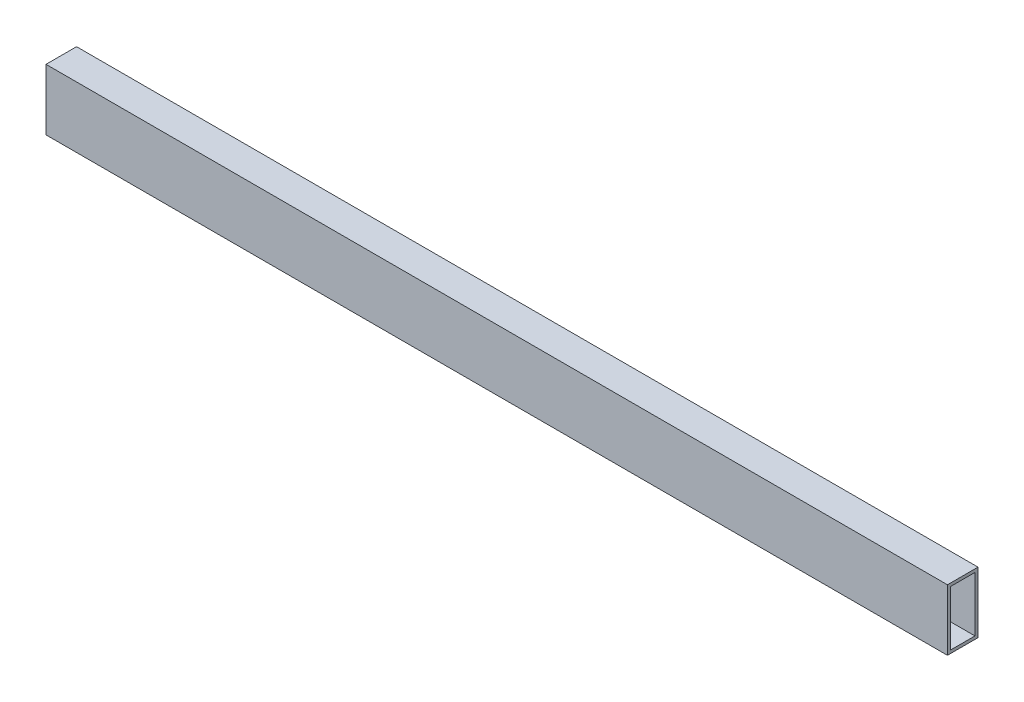
ISO-10303-21;
HEADER;
FILE_DESCRIPTION(('STEP AP214'),'2;1');
FILE_NAME('part.step','',(''),(''),'','','');
FILE_SCHEMA(('AUTOMOTIVE_DESIGN { 1 0 10303 214 1 1 1 1 }'));
ENDSEC;
DATA;
#1=APPLICATION_CONTEXT('core data for automotive mechanical design processes');
#2=APPLICATION_PROTOCOL_DEFINITION('international standard','automotive_design',2000,#1);
#3=PRODUCT_CONTEXT('',#1,'mechanical');
#4=PRODUCT('Part','Part','',(#3));
#5=PRODUCT_RELATED_PRODUCT_CATEGORY('part','',(#4));
#6=PRODUCT_DEFINITION_FORMATION('','',#4);
#7=PRODUCT_DEFINITION_CONTEXT('part definition',#1,'design');
#8=PRODUCT_DEFINITION('design','',#6,#7);
#9=PRODUCT_DEFINITION_SHAPE('','',#8);
#10=(LENGTH_UNIT() NAMED_UNIT(*) SI_UNIT(.MILLI.,.METRE.));
#11=(NAMED_UNIT(*) PLANE_ANGLE_UNIT() SI_UNIT($,.RADIAN.));
#12=(NAMED_UNIT(*) SI_UNIT($,.STERADIAN.) SOLID_ANGLE_UNIT());
#13=UNCERTAINTY_MEASURE_WITH_UNIT(LENGTH_MEASURE(1.E-05),#10,'distance_accuracy_value','');
#14=(GEOMETRIC_REPRESENTATION_CONTEXT(3) GLOBAL_UNCERTAINTY_ASSIGNED_CONTEXT((#13)) GLOBAL_UNIT_ASSIGNED_CONTEXT((#10,
#11,#12)) REPRESENTATION_CONTEXT('',''));
#15=CARTESIAN_POINT('',(0.,0.,0.));
#16=DIRECTION('',(0.,0.,1.));
#17=DIRECTION('',(1.,0.,0.));
#18=AXIS2_PLACEMENT_3D('',#15,#16,#17);
#19=CARTESIAN_POINT('',(0.,-20.,-10.));
#20=DIRECTION('',(0.,0.,-1.));
#21=DIRECTION('',(-1.,0.,0.));
#22=AXIS2_PLACEMENT_3D('',#19,#20,#21);
#23=PLANE('',#22);
#24=DIRECTION('',(1.,0.,0.));
#25=VECTOR('',#24,1.);
#26=CARTESIAN_POINT('',(0.,20.,-10.));
#27=LINE('',#26,#25);
#28=CARTESIAN_POINT('',(0.,20.,-10.));
#29=VERTEX_POINT('',#28);
#30=CARTESIAN_POINT('',(590.,20.,-10.));
#31=VERTEX_POINT('',#30);
#32=EDGE_CURVE('E110',#29,#31,#27,.T.);
#33=ORIENTED_EDGE('',*,*,#32,.T.);
#34=DIRECTION('',(0.,1.,0.));
#35=VECTOR('',#34,1.);
#36=CARTESIAN_POINT('',(590.,-20.,-10.));
#37=LINE('',#36,#35);
#38=CARTESIAN_POINT('',(590.,-20.,-10.));
#39=VERTEX_POINT('',#38);
#40=EDGE_CURVE('E102',#39,#31,#37,.T.);
#41=ORIENTED_EDGE('',*,*,#40,.F.);
#42=DIRECTION('',(1.,0.,0.));
#43=VECTOR('',#42,1.);
#44=CARTESIAN_POINT('',(0.,-20.,-10.));
#45=LINE('',#44,#43);
#46=CARTESIAN_POINT('',(0.,-20.,-10.));
#47=VERTEX_POINT('',#46);
#48=EDGE_CURVE('E97',#47,#39,#45,.T.);
#49=ORIENTED_EDGE('',*,*,#48,.F.);
#50=DIRECTION('',(0.,1.,0.));
#51=VECTOR('',#50,1.);
#52=CARTESIAN_POINT('',(0.,-20.,-10.));
#53=LINE('',#52,#51);
#54=EDGE_CURVE('E106',#47,#29,#53,.T.);
#55=ORIENTED_EDGE('',*,*,#54,.T.);
#56=EDGE_LOOP('',(#33,#41,#49,#55));
#57=FACE_BOUND('',#56,.T.);
#58=ADVANCED_FACE('F39',(#57),#23,.T.);
#59=CARTESIAN_POINT('',(0.,20.,10.));
#60=DIRECTION('',(0.,1.,0.));
#61=DIRECTION('',(0.,0.,1.));
#62=AXIS2_PLACEMENT_3D('',#59,#60,#61);
#63=PLANE('',#62);
#64=DIRECTION('',(1.,0.,0.));
#65=VECTOR('',#64,1.);
#66=CARTESIAN_POINT('',(0.,20.,10.));
#67=LINE('',#66,#65);
#68=CARTESIAN_POINT('',(0.,20.,10.));
#69=VERTEX_POINT('',#68);
#70=CARTESIAN_POINT('',(590.,20.,10.));
#71=VERTEX_POINT('',#70);
#72=EDGE_CURVE('E121',#69,#71,#67,.T.);
#73=ORIENTED_EDGE('',*,*,#72,.T.);
#74=DIRECTION('',(0.,0.,1.));
#75=VECTOR('',#74,1.);
#76=CARTESIAN_POINT('',(590.,20.,10.));
#77=LINE('',#76,#75);
#78=EDGE_CURVE('E132',#31,#71,#77,.T.);
#79=ORIENTED_EDGE('',*,*,#78,.F.);
#80=ORIENTED_EDGE('',*,*,#32,.F.);
#81=DIRECTION('',(0.,0.,1.));
#82=VECTOR('',#81,1.);
#83=CARTESIAN_POINT('',(0.,20.,10.));
#84=LINE('',#83,#82);
#85=EDGE_CURVE('E115',#29,#69,#84,.T.);
#86=ORIENTED_EDGE('',*,*,#85,.T.);
#87=EDGE_LOOP('',(#73,#79,#80,#86));
#88=FACE_BOUND('',#87,.T.);
#89=ADVANCED_FACE('F131',(#88),#63,.T.);
#90=CARTESIAN_POINT('',(0.,-20.,10.));
#91=DIRECTION('',(0.,0.,1.));
#92=DIRECTION('',(1.,0.,0.));
#93=AXIS2_PLACEMENT_3D('',#90,#91,#92);
#94=PLANE('',#93);
#95=DIRECTION('',(1.,0.,0.));
#96=VECTOR('',#95,1.);
#97=CARTESIAN_POINT('',(0.,-20.,10.));
#98=LINE('',#97,#96);
#99=CARTESIAN_POINT('',(0.,-20.,10.));
#100=VERTEX_POINT('',#99);
#101=CARTESIAN_POINT('',(590.,-20.,10.));
#102=VERTEX_POINT('',#101);
#103=EDGE_CURVE('E43',#100,#102,#98,.T.);
#104=ORIENTED_EDGE('',*,*,#103,.T.);
#105=DIRECTION('',(0.,-1.,0.));
#106=VECTOR('',#105,1.);
#107=CARTESIAN_POINT('',(590.,-20.,10.));
#108=LINE('',#107,#106);
#109=EDGE_CURVE('E136',#71,#102,#108,.T.);
#110=ORIENTED_EDGE('',*,*,#109,.F.);
#111=ORIENTED_EDGE('',*,*,#72,.F.);
#112=DIRECTION('',(0.,-1.,0.));
#113=VECTOR('',#112,1.);
#114=CARTESIAN_POINT('',(0.,-20.,10.));
#115=LINE('',#114,#113);
#116=EDGE_CURVE('E89',#69,#100,#115,.T.);
#117=ORIENTED_EDGE('',*,*,#116,.T.);
#118=EDGE_LOOP('',(#104,#110,#111,#117));
#119=FACE_BOUND('',#118,.T.);
#120=ADVANCED_FACE('F218',(#119),#94,.T.);
#121=CARTESIAN_POINT('',(0.,-20.,10.));
#122=DIRECTION('',(0.,-1.,0.));
#123=DIRECTION('',(0.,0.,-1.));
#124=AXIS2_PLACEMENT_3D('',#121,#122,#123);
#125=PLANE('',#124);
#126=DIRECTION('',(0.,0.,-1.));
#127=VECTOR('',#126,1.);
#128=CARTESIAN_POINT('',(590.,-20.,10.));
#129=LINE('',#128,#127);
#130=EDGE_CURVE('E141',#102,#39,#129,.T.);
#131=ORIENTED_EDGE('',*,*,#130,.F.);
#132=ORIENTED_EDGE('',*,*,#103,.F.);
#133=DIRECTION('',(0.,0.,-1.));
#134=VECTOR('',#133,1.);
#135=CARTESIAN_POINT('',(0.,-20.,10.));
#136=LINE('',#135,#134);
#137=EDGE_CURVE('E95',#100,#47,#136,.T.);
#138=ORIENTED_EDGE('',*,*,#137,.T.);
#139=ORIENTED_EDGE('',*,*,#48,.T.);
#140=EDGE_LOOP('',(#131,#132,#138,#139));
#141=FACE_BOUND('',#140,.T.);
#142=ADVANCED_FACE('F41',(#141),#125,.T.);
#143=CARTESIAN_POINT('',(0.,0.,0.));
#144=DIRECTION('',(-1.,0.,0.));
#145=DIRECTION('',(0.,0.,1.));
#146=AXIS2_PLACEMENT_3D('',#143,#144,#145);
#147=PLANE('',#146);
#148=ORIENTED_EDGE('',*,*,#54,.F.);
#149=ORIENTED_EDGE('',*,*,#137,.F.);
#150=ORIENTED_EDGE('',*,*,#116,.F.);
#151=ORIENTED_EDGE('',*,*,#85,.F.);
#152=EDGE_LOOP('',(#148,#149,#150,#151));
#153=FACE_BOUND('',#152,.T.);
#154=DIRECTION('',(0.,-1.,0.));
#155=VECTOR('',#154,1.);
#156=CARTESIAN_POINT('',(0.,-18.,8.));
#157=LINE('',#156,#155);
#158=CARTESIAN_POINT('',(0.,-18.,8.));
#159=VERTEX_POINT('',#158);
#160=CARTESIAN_POINT('',(0.,18.,8.));
#161=VERTEX_POINT('',#160);
#162=EDGE_CURVE('E147',#159,#161,#157,.F.);
#163=ORIENTED_EDGE('',*,*,#162,.F.);
#164=DIRECTION('',(0.,0.,-1.));
#165=VECTOR('',#164,1.);
#166=CARTESIAN_POINT('',(0.,-18.,8.));
#167=LINE('',#166,#165);
#168=CARTESIAN_POINT('',(0.,-18.,-8.));
#169=VERTEX_POINT('',#168);
#170=EDGE_CURVE('E152',#169,#159,#167,.F.);
#171=ORIENTED_EDGE('',*,*,#170,.F.);
#172=DIRECTION('',(0.,1.,0.));
#173=VECTOR('',#172,1.);
#174=CARTESIAN_POINT('',(0.,-18.,-8.));
#175=LINE('',#174,#173);
#176=CARTESIAN_POINT('',(0.,18.,-8.));
#177=VERTEX_POINT('',#176);
#178=EDGE_CURVE('E162',#177,#169,#175,.F.);
#179=ORIENTED_EDGE('',*,*,#178,.F.);
#180=DIRECTION('',(0.,0.,1.));
#181=VECTOR('',#180,1.);
#182=CARTESIAN_POINT('',(0.,18.,8.));
#183=LINE('',#182,#181);
#184=EDGE_CURVE('E145',#161,#177,#183,.F.);
#185=ORIENTED_EDGE('',*,*,#184,.F.);
#186=EDGE_LOOP('',(#163,#171,#179,#185));
#187=FACE_BOUND('',#186,.T.);
#188=ADVANCED_FACE('F113',(#153,#187),#147,.T.);
#189=CARTESIAN_POINT('',(590.,0.,0.));
#190=DIRECTION('',(-1.,0.,0.));
#191=DIRECTION('',(0.,0.,1.));
#192=AXIS2_PLACEMENT_3D('',#189,#190,#191);
#193=PLANE('',#192);
#194=ORIENTED_EDGE('',*,*,#40,.T.);
#195=ORIENTED_EDGE('',*,*,#78,.T.);
#196=ORIENTED_EDGE('',*,*,#109,.T.);
#197=ORIENTED_EDGE('',*,*,#130,.T.);
#198=EDGE_LOOP('',(#194,#195,#196,#197));
#199=FACE_BOUND('',#198,.T.);
#200=DIRECTION('',(0.,-1.,0.));
#201=VECTOR('',#200,1.);
#202=CARTESIAN_POINT('',(590.,-18.,8.));
#203=LINE('',#202,#201);
#204=CARTESIAN_POINT('',(590.,-18.,8.));
#205=VERTEX_POINT('',#204);
#206=CARTESIAN_POINT('',(590.,18.,8.));
#207=VERTEX_POINT('',#206);
#208=EDGE_CURVE('E11',#205,#207,#203,.F.);
#209=ORIENTED_EDGE('',*,*,#208,.T.);
#210=DIRECTION('',(0.,0.,1.));
#211=VECTOR('',#210,1.);
#212=CARTESIAN_POINT('',(590.,18.,8.));
#213=LINE('',#212,#211);
#214=CARTESIAN_POINT('',(590.,18.,-8.));
#215=VERTEX_POINT('',#214);
#216=EDGE_CURVE('E176',#207,#215,#213,.F.);
#217=ORIENTED_EDGE('',*,*,#216,.T.);
#218=DIRECTION('',(0.,1.,0.));
#219=VECTOR('',#218,1.);
#220=CARTESIAN_POINT('',(590.,-18.,-8.));
#221=LINE('',#220,#219);
#222=CARTESIAN_POINT('',(590.,-18.,-8.));
#223=VERTEX_POINT('',#222);
#224=EDGE_CURVE('E166',#215,#223,#221,.F.);
#225=ORIENTED_EDGE('',*,*,#224,.T.);
#226=DIRECTION('',(0.,0.,-1.));
#227=VECTOR('',#226,1.);
#228=CARTESIAN_POINT('',(590.,-18.,8.));
#229=LINE('',#228,#227);
#230=EDGE_CURVE('E58',#223,#205,#229,.F.);
#231=ORIENTED_EDGE('',*,*,#230,.T.);
#232=EDGE_LOOP('',(#209,#217,#225,#231));
#233=FACE_BOUND('',#232,.T.);
#234=ADVANCED_FACE('F135',(#199,#233),#193,.F.);
#235=CARTESIAN_POINT('',(0.,18.,8.));
#236=DIRECTION('',(0.,-1.,0.));
#237=DIRECTION('',(0.,0.,-1.));
#238=AXIS2_PLACEMENT_3D('',#235,#236,#237);
#239=PLANE('',#238);
#240=DIRECTION('',(1.,0.,0.));
#241=VECTOR('',#240,1.);
#242=CARTESIAN_POINT('',(0.,18.,-8.));
#243=LINE('',#242,#241);
#244=EDGE_CURVE('E169',#177,#215,#243,.T.);
#245=ORIENTED_EDGE('',*,*,#244,.T.);
#246=ORIENTED_EDGE('',*,*,#216,.F.);
#247=DIRECTION('',(1.,0.,0.));
#248=VECTOR('',#247,1.);
#249=CARTESIAN_POINT('',(0.,18.,8.));
#250=LINE('',#249,#248);
#251=EDGE_CURVE('E151',#161,#207,#250,.T.);
#252=ORIENTED_EDGE('',*,*,#251,.F.);
#253=ORIENTED_EDGE('',*,*,#184,.T.);
#254=EDGE_LOOP('',(#245,#246,#252,#253));
#255=FACE_BOUND('',#254,.T.);
#256=ADVANCED_FACE('F190',(#255),#239,.T.);
#257=CARTESIAN_POINT('',(0.,-18.,-8.));
#258=DIRECTION('',(0.,0.,1.));
#259=DIRECTION('',(0.,-1.,0.));
#260=AXIS2_PLACEMENT_3D('',#257,#258,#259);
#261=PLANE('',#260);
#262=DIRECTION('',(1.,0.,0.));
#263=VECTOR('',#262,1.);
#264=CARTESIAN_POINT('',(0.,-18.,-8.));
#265=LINE('',#264,#263);
#266=EDGE_CURVE('E158',#169,#223,#265,.T.);
#267=ORIENTED_EDGE('',*,*,#266,.T.);
#268=ORIENTED_EDGE('',*,*,#224,.F.);
#269=ORIENTED_EDGE('',*,*,#244,.F.);
#270=ORIENTED_EDGE('',*,*,#178,.T.);
#271=EDGE_LOOP('',(#267,#268,#269,#270));
#272=FACE_BOUND('',#271,.T.);
#273=ADVANCED_FACE('F198',(#272),#261,.T.);
#274=CARTESIAN_POINT('',(0.,-18.,8.));
#275=DIRECTION('',(0.,1.,0.));
#276=DIRECTION('',(0.,0.,1.));
#277=AXIS2_PLACEMENT_3D('',#274,#275,#276);
#278=PLANE('',#277);
#279=DIRECTION('',(1.,0.,0.));
#280=VECTOR('',#279,1.);
#281=CARTESIAN_POINT('',(0.,-18.,8.));
#282=LINE('',#281,#280);
#283=EDGE_CURVE('E50',#159,#205,#282,.T.);
#284=ORIENTED_EDGE('',*,*,#283,.T.);
#285=ORIENTED_EDGE('',*,*,#230,.F.);
#286=ORIENTED_EDGE('',*,*,#266,.F.);
#287=ORIENTED_EDGE('',*,*,#170,.T.);
#288=EDGE_LOOP('',(#284,#285,#286,#287));
#289=FACE_BOUND('',#288,.T.);
#290=ADVANCED_FACE('F203',(#289),#278,.T.);
#291=CARTESIAN_POINT('',(0.,-18.,8.));
#292=DIRECTION('',(0.,0.,-1.));
#293=DIRECTION('',(-1.,0.,0.));
#294=AXIS2_PLACEMENT_3D('',#291,#292,#293);
#295=PLANE('',#294);
#296=ORIENTED_EDGE('',*,*,#208,.F.);
#297=ORIENTED_EDGE('',*,*,#283,.F.);
#298=ORIENTED_EDGE('',*,*,#162,.T.);
#299=ORIENTED_EDGE('',*,*,#251,.T.);
#300=EDGE_LOOP('',(#296,#297,#298,#299));
#301=FACE_BOUND('',#300,.T.);
#302=ADVANCED_FACE('F207',(#301),#295,.T.);
#303=CLOSED_SHELL('',(#58,#89,#120,#142,#188,#234,#256,#273,#290,#302));
#304=MANIFOLD_SOLID_BREP('B2',#303);
#305=ADVANCED_BREP_SHAPE_REPRESENTATION('',(#18,#304),#14);
#306=SHAPE_DEFINITION_REPRESENTATION(#9,#305);
ENDSEC;
END-ISO-10303-21;
